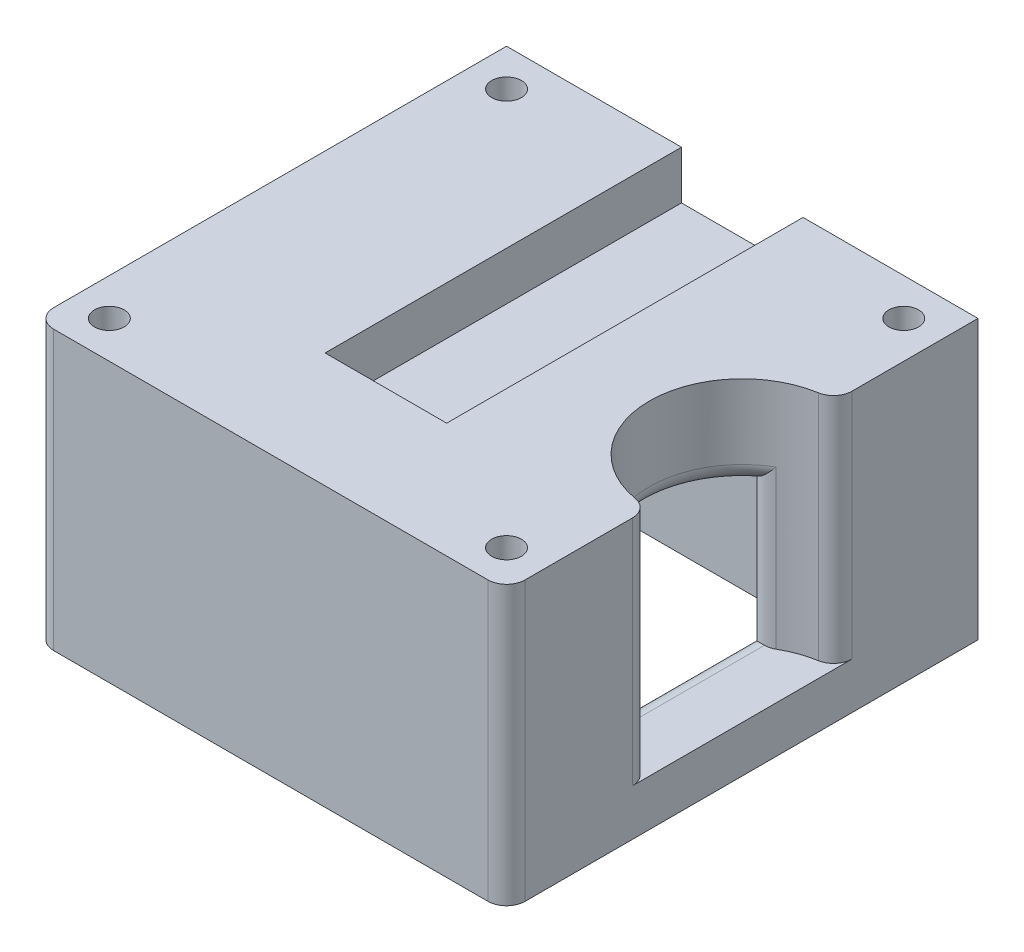
ISO-10303-21;
HEADER;
FILE_DESCRIPTION(('STEP AP214'),'2;1');
FILE_NAME('part.step','',(''),(''),'','','');
FILE_SCHEMA(('AUTOMOTIVE_DESIGN { 1 0 10303 214 1 1 1 1 }'));
ENDSEC;
DATA;
#1=APPLICATION_CONTEXT('core data for automotive mechanical design processes');
#2=APPLICATION_PROTOCOL_DEFINITION('international standard','automotive_design',2000,#1);
#3=PRODUCT_CONTEXT('',#1,'mechanical');
#4=PRODUCT('Part','Part','',(#3));
#5=PRODUCT_RELATED_PRODUCT_CATEGORY('part','',(#4));
#6=PRODUCT_DEFINITION_FORMATION('','',#4);
#7=PRODUCT_DEFINITION_CONTEXT('part definition',#1,'design');
#8=PRODUCT_DEFINITION('design','',#6,#7);
#9=PRODUCT_DEFINITION_SHAPE('','',#8);
#10=(LENGTH_UNIT() NAMED_UNIT(*) SI_UNIT(.MILLI.,.METRE.));
#11=(NAMED_UNIT(*) PLANE_ANGLE_UNIT() SI_UNIT($,.RADIAN.));
#12=(NAMED_UNIT(*) SI_UNIT($,.STERADIAN.) SOLID_ANGLE_UNIT());
#13=UNCERTAINTY_MEASURE_WITH_UNIT(LENGTH_MEASURE(1.E-05),#10,'distance_accuracy_value','');
#14=(GEOMETRIC_REPRESENTATION_CONTEXT(3) GLOBAL_UNCERTAINTY_ASSIGNED_CONTEXT((#13)) GLOBAL_UNIT_ASSIGNED_CONTEXT((#10,
#11,#12)) REPRESENTATION_CONTEXT('',''));
#15=CARTESIAN_POINT('',(0.,0.,0.));
#16=DIRECTION('',(0.,0.,1.));
#17=DIRECTION('',(1.,0.,0.));
#18=AXIS2_PLACEMENT_3D('',#15,#16,#17);
#19=CARTESIAN_POINT('',(0.,0.,0.));
#20=DIRECTION('',(0.,1.,0.));
#21=DIRECTION('',(0.,0.,1.));
#22=AXIS2_PLACEMENT_3D('',#19,#20,#21);
#23=PLANE('',#22);
#24=CARTESIAN_POINT('',(-10.7,0.,10.7));
#25=DIRECTION('',(0.,-1.,0.));
#26=DIRECTION('',(0.,0.,-1.));
#27=AXIS2_PLACEMENT_3D('',#24,#25,#26);
#28=CIRCLE('',#27,0.799999999999999);
#29=CARTESIAN_POINT('',(-10.7,0.,9.9));
#30=VERTEX_POINT('',#29);
#31=EDGE_CURVE('E559',#30,#30,#28,.T.);
#32=ORIENTED_EDGE('',*,*,#31,.F.);
#33=EDGE_LOOP('',(#32));
#34=FACE_BOUND('',#33,.T.);
#35=CARTESIAN_POINT('',(10.7,0.,10.7));
#36=DIRECTION('',(0.,-1.,0.));
#37=DIRECTION('',(0.,0.,-1.));
#38=AXIS2_PLACEMENT_3D('',#35,#36,#37);
#39=CIRCLE('',#38,0.799999999999999);
#40=CARTESIAN_POINT('',(10.7,0.,9.9));
#41=VERTEX_POINT('',#40);
#42=EDGE_CURVE('E553',#41,#41,#39,.T.);
#43=ORIENTED_EDGE('',*,*,#42,.F.);
#44=EDGE_LOOP('',(#43));
#45=FACE_BOUND('',#44,.T.);
#46=CARTESIAN_POINT('',(10.7,0.,-10.7));
#47=DIRECTION('',(0.,-1.,0.));
#48=DIRECTION('',(0.,0.,-1.));
#49=AXIS2_PLACEMENT_3D('',#46,#47,#48);
#50=CIRCLE('',#49,0.799999999999999);
#51=CARTESIAN_POINT('',(10.7,0.,-11.5));
#52=VERTEX_POINT('',#51);
#53=EDGE_CURVE('E545',#52,#52,#50,.T.);
#54=ORIENTED_EDGE('',*,*,#53,.F.);
#55=EDGE_LOOP('',(#54));
#56=FACE_BOUND('',#55,.T.);
#57=DIRECTION('',(0.,0.,-1.));
#58=VECTOR('',#57,1.);
#59=CARTESIAN_POINT('',(12.7,0.,12.7));
#60=LINE('',#59,#58);
#61=CARTESIAN_POINT('',(12.7,0.,11.7));
#62=VERTEX_POINT('',#61);
#63=CARTESIAN_POINT('',(12.7,0.,-12.7));
#64=VERTEX_POINT('',#63);
#65=EDGE_CURVE('E287',#62,#64,#60,.T.);
#66=ORIENTED_EDGE('',*,*,#65,.F.);
#67=CARTESIAN_POINT('',(11.7,0.,11.7));
#68=DIRECTION('',(0.,1.,0.));
#69=DIRECTION('',(0.,0.,1.));
#70=AXIS2_PLACEMENT_3D('',#67,#68,#69);
#71=CIRCLE('',#70,1.);
#72=CARTESIAN_POINT('',(11.7,0.,12.7));
#73=VERTEX_POINT('',#72);
#74=EDGE_CURVE('E468',#62,#73,#71,.F.);
#75=ORIENTED_EDGE('',*,*,#74,.T.);
#76=DIRECTION('',(1.,0.,0.));
#77=VECTOR('',#76,1.);
#78=CARTESIAN_POINT('',(12.7,0.,12.7));
#79=LINE('',#78,#77);
#80=CARTESIAN_POINT('',(-11.7,0.,12.7));
#81=VERTEX_POINT('',#80);
#82=EDGE_CURVE('E285',#81,#73,#79,.T.);
#83=ORIENTED_EDGE('',*,*,#82,.F.);
#84=CARTESIAN_POINT('',(-11.7,0.,11.7));
#85=DIRECTION('',(0.,1.,0.));
#86=DIRECTION('',(0.,0.,1.));
#87=AXIS2_PLACEMENT_3D('',#84,#85,#86);
#88=CIRCLE('',#87,1.);
#89=CARTESIAN_POINT('',(-12.7,0.,11.7));
#90=VERTEX_POINT('',#89);
#91=EDGE_CURVE('E469',#81,#90,#88,.F.);
#92=ORIENTED_EDGE('',*,*,#91,.T.);
#93=DIRECTION('',(0.,0.,1.));
#94=VECTOR('',#93,1.);
#95=CARTESIAN_POINT('',(-12.7,0.,12.7));
#96=LINE('',#95,#94);
#97=CARTESIAN_POINT('',(-12.7,0.,-12.7));
#98=VERTEX_POINT('',#97);
#99=EDGE_CURVE('E283',#98,#90,#96,.T.);
#100=ORIENTED_EDGE('',*,*,#99,.F.);
#101=DIRECTION('',(-1.,0.,0.));
#102=VECTOR('',#101,1.);
#103=CARTESIAN_POINT('',(12.7,0.,-12.7));
#104=LINE('',#103,#102);
#105=EDGE_CURVE('E289',#64,#98,#104,.T.);
#106=ORIENTED_EDGE('',*,*,#105,.F.);
#107=EDGE_LOOP('',(#66,#75,#83,#92,#100,#106));
#108=FACE_BOUND('',#107,.T.);
#109=DIRECTION('',(0.,0.,1.));
#110=VECTOR('',#109,1.);
#111=CARTESIAN_POINT('',(-8.7,0.,8.7));
#112=LINE('',#111,#110);
#113=CARTESIAN_POINT('',(-8.7,0.,-8.7));
#114=VERTEX_POINT('',#113);
#115=CARTESIAN_POINT('',(-8.7,0.,8.7));
#116=VERTEX_POINT('',#115);
#117=EDGE_CURVE('E248',#114,#116,#112,.T.);
#118=ORIENTED_EDGE('',*,*,#117,.T.);
#119=DIRECTION('',(1.,0.,0.));
#120=VECTOR('',#119,1.);
#121=CARTESIAN_POINT('',(8.7,0.,8.7));
#122=LINE('',#121,#120);
#123=CARTESIAN_POINT('',(8.7,0.,8.7));
#124=VERTEX_POINT('',#123);
#125=EDGE_CURVE('E266',#116,#124,#122,.T.);
#126=ORIENTED_EDGE('',*,*,#125,.T.);
#127=DIRECTION('',(0.,0.,-1.));
#128=VECTOR('',#127,1.);
#129=CARTESIAN_POINT('',(8.7,0.,8.7));
#130=LINE('',#129,#128);
#131=CARTESIAN_POINT('',(8.7,0.,-8.7));
#132=VERTEX_POINT('',#131);
#133=EDGE_CURVE('E269',#124,#132,#130,.T.);
#134=ORIENTED_EDGE('',*,*,#133,.T.);
#135=DIRECTION('',(-1.,0.,0.));
#136=VECTOR('',#135,1.);
#137=CARTESIAN_POINT('',(8.7,0.,-8.7));
#138=LINE('',#137,#136);
#139=EDGE_CURVE('E253',#132,#114,#138,.T.);
#140=ORIENTED_EDGE('',*,*,#139,.T.);
#141=EDGE_LOOP('',(#118,#126,#134,#140));
#142=FACE_BOUND('',#141,.T.);
#143=CARTESIAN_POINT('',(-10.7,0.,-10.7));
#144=DIRECTION('',(0.,-1.,0.));
#145=DIRECTION('',(0.,0.,-1.));
#146=AXIS2_PLACEMENT_3D('',#143,#144,#145);
#147=CIRCLE('',#146,0.799999999999999);
#148=CARTESIAN_POINT('',(-10.7,0.,-11.5));
#149=VERTEX_POINT('',#148);
#150=EDGE_CURVE('E540',#149,#149,#147,.T.);
#151=ORIENTED_EDGE('',*,*,#150,.F.);
#152=EDGE_LOOP('',(#151));
#153=FACE_BOUND('',#152,.T.);
#154=ADVANCED_FACE('F33',(#34,#45,#56,#108,#142,#153),#23,.F.);
#155=CARTESIAN_POINT('',(12.7,10.,-12.7));
#156=DIRECTION('',(0.,0.,1.));
#157=DIRECTION('',(1.,0.,0.));
#158=AXIS2_PLACEMENT_3D('',#155,#156,#157);
#159=PLANE('',#158);
#160=DIRECTION('',(0.,1.,0.));
#161=VECTOR('',#160,1.);
#162=CARTESIAN_POINT('',(-3.275,12.4,-12.7));
#163=LINE('',#162,#161);
#164=CARTESIAN_POINT('',(-3.275,12.4,-12.7));
#165=VERTEX_POINT('',#164);
#166=CARTESIAN_POINT('',(-3.275,15.,-12.7));
#167=VERTEX_POINT('',#166);
#168=EDGE_CURVE('E235',#165,#167,#163,.T.);
#169=ORIENTED_EDGE('',*,*,#168,.F.);
#170=DIRECTION('',(-1.,0.,0.));
#171=VECTOR('',#170,1.);
#172=CARTESIAN_POINT('',(0.,12.4,-12.7));
#173=LINE('',#172,#171);
#174=CARTESIAN_POINT('',(3.275,12.4,-12.7));
#175=VERTEX_POINT('',#174);
#176=EDGE_CURVE('E220',#175,#165,#173,.T.);
#177=ORIENTED_EDGE('',*,*,#176,.F.);
#178=DIRECTION('',(0.,1.,0.));
#179=VECTOR('',#178,1.);
#180=CARTESIAN_POINT('',(3.275,12.4,-12.7));
#181=LINE('',#180,#179);
#182=CARTESIAN_POINT('',(3.275,15.,-12.7));
#183=VERTEX_POINT('',#182);
#184=EDGE_CURVE('E207',#175,#183,#181,.T.);
#185=ORIENTED_EDGE('',*,*,#184,.T.);
#186=DIRECTION('',(-1.,0.,0.));
#187=VECTOR('',#186,1.);
#188=CARTESIAN_POINT('',(12.7,15.,-12.7));
#189=LINE('',#188,#187);
#190=CARTESIAN_POINT('',(12.7,15.,-12.7));
#191=VERTEX_POINT('',#190);
#192=EDGE_CURVE('E241',#191,#183,#189,.T.);
#193=ORIENTED_EDGE('',*,*,#192,.F.);
#194=DIRECTION('',(0.,-1.,0.));
#195=VECTOR('',#194,1.);
#196=CARTESIAN_POINT('',(12.7,10.,-12.7));
#197=LINE('',#196,#195);
#198=EDGE_CURVE('E294',#191,#64,#197,.T.);
#199=ORIENTED_EDGE('',*,*,#198,.T.);
#200=ORIENTED_EDGE('',*,*,#105,.T.);
#201=DIRECTION('',(0.,-1.,0.));
#202=VECTOR('',#201,1.);
#203=CARTESIAN_POINT('',(-12.7,10.,-12.7));
#204=LINE('',#203,#202);
#205=CARTESIAN_POINT('',(-12.7,15.,-12.7));
#206=VERTEX_POINT('',#205);
#207=EDGE_CURVE('E291',#206,#98,#204,.T.);
#208=ORIENTED_EDGE('',*,*,#207,.F.);
#209=EDGE_CURVE('E240',#167,#206,#189,.T.);
#210=ORIENTED_EDGE('',*,*,#209,.F.);
#211=EDGE_LOOP('',(#169,#177,#185,#193,#199,#200,#208,#210));
#212=FACE_BOUND('',#211,.T.);
#213=ADVANCED_FACE('F398',(#212),#159,.F.);
#214=CARTESIAN_POINT('',(0.,15.,0.));
#215=DIRECTION('',(0.,1.,0.));
#216=DIRECTION('',(0.,0.,1.));
#217=AXIS2_PLACEMENT_3D('',#214,#215,#216);
#218=PLANE('',#217);
#219=CARTESIAN_POINT('',(-10.7,15.,10.7));
#220=DIRECTION('',(0.,-1.,0.));
#221=DIRECTION('',(0.,0.,-1.));
#222=AXIS2_PLACEMENT_3D('',#219,#220,#221);
#223=CIRCLE('',#222,0.799999999999997);
#224=CARTESIAN_POINT('',(-10.7,15.,9.9));
#225=VERTEX_POINT('',#224);
#226=EDGE_CURVE('E556',#225,#225,#223,.T.);
#227=ORIENTED_EDGE('',*,*,#226,.T.);
#228=EDGE_LOOP('',(#227));
#229=FACE_BOUND('',#228,.T.);
#230=CARTESIAN_POINT('',(10.7,15.,10.7));
#231=DIRECTION('',(0.,-1.,0.));
#232=DIRECTION('',(0.,0.,-1.));
#233=AXIS2_PLACEMENT_3D('',#230,#231,#232);
#234=CIRCLE('',#233,0.799999999999997);
#235=CARTESIAN_POINT('',(10.7,15.,9.9));
#236=VERTEX_POINT('',#235);
#237=EDGE_CURVE('E550',#236,#236,#234,.T.);
#238=ORIENTED_EDGE('',*,*,#237,.T.);
#239=EDGE_LOOP('',(#238));
#240=FACE_BOUND('',#239,.T.);
#241=CARTESIAN_POINT('',(10.7,15.,-10.7));
#242=DIRECTION('',(0.,-1.,0.));
#243=DIRECTION('',(0.,0.,-1.));
#244=AXIS2_PLACEMENT_3D('',#241,#242,#243);
#245=CIRCLE('',#244,0.799999999999997);
#246=CARTESIAN_POINT('',(10.7,15.,-11.5));
#247=VERTEX_POINT('',#246);
#248=EDGE_CURVE('E542',#247,#247,#245,.T.);
#249=ORIENTED_EDGE('',*,*,#248,.T.);
#250=EDGE_LOOP('',(#249));
#251=FACE_BOUND('',#250,.T.);
#252=CARTESIAN_POINT('',(-10.7,15.,-10.7));
#253=DIRECTION('',(0.,-1.,0.));
#254=DIRECTION('',(0.,0.,-1.));
#255=AXIS2_PLACEMENT_3D('',#252,#253,#254);
#256=CIRCLE('',#255,0.799999999999997);
#257=CARTESIAN_POINT('',(-10.7,15.,-11.5));
#258=VERTEX_POINT('',#257);
#259=EDGE_CURVE('E347',#258,#258,#256,.T.);
#260=ORIENTED_EDGE('',*,*,#259,.T.);
#261=EDGE_LOOP('',(#260));
#262=FACE_BOUND('',#261,.T.);
#263=DIRECTION('',(1.,0.,0.));
#264=VECTOR('',#263,1.);
#265=CARTESIAN_POINT('',(12.7,15.,12.7));
#266=LINE('',#265,#264);
#267=CARTESIAN_POINT('',(-11.7,15.,12.7));
#268=VERTEX_POINT('',#267);
#269=CARTESIAN_POINT('',(11.7,15.,12.7));
#270=VERTEX_POINT('',#269);
#271=EDGE_CURVE('E246',#268,#270,#266,.T.);
#272=ORIENTED_EDGE('',*,*,#271,.T.);
#273=CARTESIAN_POINT('',(11.7,15.,11.7));
#274=DIRECTION('',(0.,1.,0.));
#275=DIRECTION('',(0.,0.,1.));
#276=AXIS2_PLACEMENT_3D('',#273,#274,#275);
#277=CIRCLE('',#276,1.);
#278=CARTESIAN_POINT('',(12.7,15.,11.7));
#279=VERTEX_POINT('',#278);
#280=EDGE_CURVE('E41',#270,#279,#277,.T.);
#281=ORIENTED_EDGE('',*,*,#280,.T.);
#282=DIRECTION('',(0.,0.,-1.));
#283=VECTOR('',#282,1.);
#284=CARTESIAN_POINT('',(12.7,15.,12.7));
#285=LINE('',#284,#283);
#286=CARTESIAN_POINT('',(12.7,15.,5.91607978309961));
#287=VERTEX_POINT('',#286);
#288=EDGE_CURVE('E238',#279,#287,#285,.T.);
#289=ORIENTED_EDGE('',*,*,#288,.T.);
#290=CARTESIAN_POINT('',(11.7,15.,5.91607978309961));
#291=DIRECTION('',(0.,1.,0.));
#292=DIRECTION('',(0.,0.,1.));
#293=AXIS2_PLACEMENT_3D('',#290,#291,#292);
#294=CIRCLE('',#293,1.);
#295=CARTESIAN_POINT('',(11.8666666666667,15.,4.93006648591634));
#296=VERTEX_POINT('',#295);
#297=EDGE_CURVE('E324',#287,#296,#294,.T.);
#298=ORIENTED_EDGE('',*,*,#297,.T.);
#299=CARTESIAN_POINT('',(12.7,15.,0.));
#300=DIRECTION('',(0.,1.,0.));
#301=DIRECTION('',(0.,0.,1.));
#302=AXIS2_PLACEMENT_3D('',#299,#300,#301);
#303=CIRCLE('',#302,5.);
#304=CARTESIAN_POINT('',(11.8666666666667,15.,-4.93006648591635));
#305=VERTEX_POINT('',#304);
#306=EDGE_CURVE('E447',#305,#296,#303,.T.);
#307=ORIENTED_EDGE('',*,*,#306,.F.);
#308=CARTESIAN_POINT('',(11.7,15.,-5.91607978309962));
#309=DIRECTION('',(0.,1.,0.));
#310=DIRECTION('',(0.,0.,1.));
#311=AXIS2_PLACEMENT_3D('',#308,#309,#310);
#312=CIRCLE('',#311,1.);
#313=CARTESIAN_POINT('',(12.7,15.,-5.91607978309962));
#314=VERTEX_POINT('',#313);
#315=EDGE_CURVE('E326',#305,#314,#312,.T.);
#316=ORIENTED_EDGE('',*,*,#315,.T.);
#317=EDGE_CURVE('E234',#314,#191,#285,.T.);
#318=ORIENTED_EDGE('',*,*,#317,.T.);
#319=ORIENTED_EDGE('',*,*,#192,.T.);
#320=DIRECTION('',(0.,0.,-1.));
#321=VECTOR('',#320,1.);
#322=CARTESIAN_POINT('',(3.275,15.,0.));
#323=LINE('',#322,#321);
#324=CARTESIAN_POINT('',(3.275,15.,6.5));
#325=VERTEX_POINT('',#324);
#326=EDGE_CURVE('E227',#325,#183,#323,.T.);
#327=ORIENTED_EDGE('',*,*,#326,.F.);
#328=DIRECTION('',(-1.,0.,0.));
#329=VECTOR('',#328,1.);
#330=CARTESIAN_POINT('',(0.,15.,6.5));
#331=LINE('',#330,#329);
#332=CARTESIAN_POINT('',(-3.275,15.,6.5));
#333=VERTEX_POINT('',#332);
#334=EDGE_CURVE('E203',#325,#333,#331,.T.);
#335=ORIENTED_EDGE('',*,*,#334,.T.);
#336=DIRECTION('',(0.,0.,-1.));
#337=VECTOR('',#336,1.);
#338=CARTESIAN_POINT('',(-3.275,15.,0.));
#339=LINE('',#338,#337);
#340=EDGE_CURVE('E216',#333,#167,#339,.T.);
#341=ORIENTED_EDGE('',*,*,#340,.T.);
#342=ORIENTED_EDGE('',*,*,#209,.T.);
#343=DIRECTION('',(0.,0.,1.));
#344=VECTOR('',#343,1.);
#345=CARTESIAN_POINT('',(-12.7,15.,12.7));
#346=LINE('',#345,#344);
#347=CARTESIAN_POINT('',(-12.7,15.,11.7));
#348=VERTEX_POINT('',#347);
#349=EDGE_CURVE('E244',#206,#348,#346,.T.);
#350=ORIENTED_EDGE('',*,*,#349,.T.);
#351=CARTESIAN_POINT('',(-11.7,15.,11.7));
#352=DIRECTION('',(0.,1.,0.));
#353=DIRECTION('',(0.,0.,1.));
#354=AXIS2_PLACEMENT_3D('',#351,#352,#353);
#355=CIRCLE('',#354,1.);
#356=EDGE_CURVE('E477',#348,#268,#355,.T.);
#357=ORIENTED_EDGE('',*,*,#356,.T.);
#358=EDGE_LOOP('',(#272,#281,#289,#298,#307,#316,#318,#319,#327,#335,#341,#342,#350,#357));
#359=FACE_BOUND('',#358,.T.);
#360=ADVANCED_FACE('F404',(#229,#240,#251,#262,#359),#218,.T.);
#361=CARTESIAN_POINT('',(-12.7,10.,12.7));
#362=DIRECTION('',(1.,0.,0.));
#363=DIRECTION('',(0.,0.,-1.));
#364=AXIS2_PLACEMENT_3D('',#361,#362,#363);
#365=PLANE('',#364);
#366=ORIENTED_EDGE('',*,*,#99,.T.);
#367=DIRECTION('',(0.,-1.,0.));
#368=VECTOR('',#367,1.);
#369=CARTESIAN_POINT('',(-12.7,10.,11.7));
#370=LINE('',#369,#368);
#371=EDGE_CURVE('E11',#90,#348,#370,.F.);
#372=ORIENTED_EDGE('',*,*,#371,.T.);
#373=ORIENTED_EDGE('',*,*,#349,.F.);
#374=ORIENTED_EDGE('',*,*,#207,.T.);
#375=EDGE_LOOP('',(#366,#372,#373,#374));
#376=FACE_BOUND('',#375,.T.);
#377=ADVANCED_FACE('F420',(#376),#365,.F.);
#378=CARTESIAN_POINT('',(12.7,10.,12.7));
#379=DIRECTION('',(0.,0.,-1.));
#380=DIRECTION('',(-1.,0.,0.));
#381=AXIS2_PLACEMENT_3D('',#378,#379,#380);
#382=PLANE('',#381);
#383=ORIENTED_EDGE('',*,*,#82,.T.);
#384=DIRECTION('',(0.,-1.,0.));
#385=VECTOR('',#384,1.);
#386=CARTESIAN_POINT('',(11.7,10.,12.7));
#387=LINE('',#386,#385);
#388=EDGE_CURVE('E54',#73,#270,#387,.F.);
#389=ORIENTED_EDGE('',*,*,#388,.T.);
#390=ORIENTED_EDGE('',*,*,#271,.F.);
#391=DIRECTION('',(0.,-1.,0.));
#392=VECTOR('',#391,1.);
#393=CARTESIAN_POINT('',(-11.7,10.,12.7));
#394=LINE('',#393,#392);
#395=EDGE_CURVE('E473',#268,#81,#394,.T.);
#396=ORIENTED_EDGE('',*,*,#395,.T.);
#397=EDGE_LOOP('',(#383,#389,#390,#396));
#398=FACE_BOUND('',#397,.T.);
#399=ADVANCED_FACE('F416',(#398),#382,.F.);
#400=CARTESIAN_POINT('',(12.7,10.,12.7));
#401=DIRECTION('',(-1.,0.,0.));
#402=DIRECTION('',(0.,0.,1.));
#403=AXIS2_PLACEMENT_3D('',#400,#401,#402);
#404=PLANE('',#403);
#405=ORIENTED_EDGE('',*,*,#288,.F.);
#406=DIRECTION('',(0.,-1.,0.));
#407=VECTOR('',#406,1.);
#408=CARTESIAN_POINT('',(12.7,10.,11.7));
#409=LINE('',#408,#407);
#410=EDGE_CURVE('E343',#279,#62,#409,.T.);
#411=ORIENTED_EDGE('',*,*,#410,.T.);
#412=ORIENTED_EDGE('',*,*,#65,.T.);
#413=ORIENTED_EDGE('',*,*,#198,.F.);
#414=ORIENTED_EDGE('',*,*,#317,.F.);
#415=DIRECTION('',(0.,1.,0.));
#416=VECTOR('',#415,1.);
#417=CARTESIAN_POINT('',(12.7,10.,-5.91607978309962));
#418=LINE('',#417,#416);
#419=CARTESIAN_POINT('',(12.7,2.5,-5.91607978309962));
#420=VERTEX_POINT('',#419);
#421=EDGE_CURVE('E321',#314,#420,#418,.F.);
#422=ORIENTED_EDGE('',*,*,#421,.T.);
#423=DIRECTION('',(0.,0.,-1.));
#424=VECTOR('',#423,1.);
#425=CARTESIAN_POINT('',(12.7,2.5,12.7));
#426=LINE('',#425,#424);
#427=CARTESIAN_POINT('',(12.7,2.5,5.91607978309961));
#428=VERTEX_POINT('',#427);
#429=EDGE_CURVE('E228',#428,#420,#426,.T.);
#430=ORIENTED_EDGE('',*,*,#429,.F.);
#431=DIRECTION('',(0.,1.,0.));
#432=VECTOR('',#431,1.);
#433=CARTESIAN_POINT('',(12.7,10.,5.91607978309961));
#434=LINE('',#433,#432);
#435=EDGE_CURVE('E318',#428,#287,#434,.T.);
#436=ORIENTED_EDGE('',*,*,#435,.T.);
#437=EDGE_LOOP('',(#405,#411,#412,#413,#414,#422,#430,#436));
#438=FACE_BOUND('',#437,.T.);
#439=ADVANCED_FACE('F413',(#438),#404,.F.);
#440=CARTESIAN_POINT('',(-8.7,10.,8.7));
#441=DIRECTION('',(1.,0.,0.));
#442=DIRECTION('',(0.,0.,-1.));
#443=AXIS2_PLACEMENT_3D('',#440,#441,#442);
#444=PLANE('',#443);
#445=ORIENTED_EDGE('',*,*,#117,.F.);
#446=DIRECTION('',(0.,-1.,0.));
#447=VECTOR('',#446,1.);
#448=CARTESIAN_POINT('',(-8.7,10.,-8.7));
#449=LINE('',#448,#447);
#450=CARTESIAN_POINT('',(-8.7,10.,-8.7));
#451=VERTEX_POINT('',#450);
#452=EDGE_CURVE('E263',#451,#114,#449,.T.);
#453=ORIENTED_EDGE('',*,*,#452,.F.);
#454=DIRECTION('',(0.,0.,1.));
#455=VECTOR('',#454,1.);
#456=CARTESIAN_POINT('',(-8.7,10.,8.7));
#457=LINE('',#456,#455);
#458=CARTESIAN_POINT('',(-8.7,10.,8.7));
#459=VERTEX_POINT('',#458);
#460=EDGE_CURVE('E249',#451,#459,#457,.T.);
#461=ORIENTED_EDGE('',*,*,#460,.T.);
#462=DIRECTION('',(0.,-1.,0.));
#463=VECTOR('',#462,1.);
#464=CARTESIAN_POINT('',(-8.7,10.,8.7));
#465=LINE('',#464,#463);
#466=EDGE_CURVE('E280',#459,#116,#465,.T.);
#467=ORIENTED_EDGE('',*,*,#466,.T.);
#468=EDGE_LOOP('',(#445,#453,#461,#467));
#469=FACE_BOUND('',#468,.T.);
#470=ADVANCED_FACE('F410',(#469),#444,.T.);
#471=CARTESIAN_POINT('',(8.7,10.,8.7));
#472=DIRECTION('',(0.,0.,-1.));
#473=DIRECTION('',(-1.,0.,0.));
#474=AXIS2_PLACEMENT_3D('',#471,#472,#473);
#475=PLANE('',#474);
#476=ORIENTED_EDGE('',*,*,#125,.F.);
#477=ORIENTED_EDGE('',*,*,#466,.F.);
#478=DIRECTION('',(1.,0.,0.));
#479=VECTOR('',#478,1.);
#480=CARTESIAN_POINT('',(8.7,10.,8.7));
#481=LINE('',#480,#479);
#482=CARTESIAN_POINT('',(8.7,10.,8.7));
#483=VERTEX_POINT('',#482);
#484=EDGE_CURVE('E252',#459,#483,#481,.T.);
#485=ORIENTED_EDGE('',*,*,#484,.T.);
#486=DIRECTION('',(0.,-1.,0.));
#487=VECTOR('',#486,1.);
#488=CARTESIAN_POINT('',(8.7,10.,8.7));
#489=LINE('',#488,#487);
#490=EDGE_CURVE('E278',#483,#124,#489,.T.);
#491=ORIENTED_EDGE('',*,*,#490,.T.);
#492=EDGE_LOOP('',(#476,#477,#485,#491));
#493=FACE_BOUND('',#492,.T.);
#494=ADVANCED_FACE('F514',(#493),#475,.T.);
#495=CARTESIAN_POINT('',(8.7,10.,8.7));
#496=DIRECTION('',(-1.,0.,0.));
#497=DIRECTION('',(0.,0.,1.));
#498=AXIS2_PLACEMENT_3D('',#495,#496,#497);
#499=PLANE('',#498);
#500=DIRECTION('',(0.,0.,-1.));
#501=VECTOR('',#500,1.);
#502=CARTESIAN_POINT('',(8.7,1.5,8.7));
#503=LINE('',#502,#501);
#504=CARTESIAN_POINT('',(8.7,1.5,5.19615242270663));
#505=VERTEX_POINT('',#504);
#506=CARTESIAN_POINT('',(8.7,1.5,-5.19615242270663));
#507=VERTEX_POINT('',#506);
#508=EDGE_CURVE('E299',#505,#507,#503,.T.);
#509=ORIENTED_EDGE('',*,*,#508,.T.);
#510=DIRECTION('',(0.,-1.,0.));
#511=VECTOR('',#510,1.);
#512=CARTESIAN_POINT('',(8.7,10.,-5.19615242270663));
#513=LINE('',#512,#511);
#514=CARTESIAN_POINT('',(8.7,10.,-5.19615242270663));
#515=VERTEX_POINT('',#514);
#516=EDGE_CURVE('E302',#507,#515,#513,.F.);
#517=ORIENTED_EDGE('',*,*,#516,.T.);
#518=DIRECTION('',(0.,0.,-1.));
#519=VECTOR('',#518,1.);
#520=CARTESIAN_POINT('',(8.7,10.,8.7));
#521=LINE('',#520,#519);
#522=CARTESIAN_POINT('',(8.7,10.,-8.7));
#523=VERTEX_POINT('',#522);
#524=EDGE_CURVE('E256',#515,#523,#521,.T.);
#525=ORIENTED_EDGE('',*,*,#524,.T.);
#526=DIRECTION('',(0.,-1.,0.));
#527=VECTOR('',#526,1.);
#528=CARTESIAN_POINT('',(8.7,10.,-8.7));
#529=LINE('',#528,#527);
#530=EDGE_CURVE('E276',#523,#132,#529,.T.);
#531=ORIENTED_EDGE('',*,*,#530,.T.);
#532=ORIENTED_EDGE('',*,*,#133,.F.);
#533=ORIENTED_EDGE('',*,*,#490,.F.);
#534=CARTESIAN_POINT('',(8.7,10.,5.19615242270663));
#535=VERTEX_POINT('',#534);
#536=EDGE_CURVE('E257',#483,#535,#521,.T.);
#537=ORIENTED_EDGE('',*,*,#536,.T.);
#538=DIRECTION('',(0.,-1.,0.));
#539=VECTOR('',#538,1.);
#540=CARTESIAN_POINT('',(8.7,2.5,5.19615242270663));
#541=LINE('',#540,#539);
#542=EDGE_CURVE('E297',#535,#505,#541,.T.);
#543=ORIENTED_EDGE('',*,*,#542,.T.);
#544=EDGE_LOOP('',(#509,#517,#525,#531,#532,#533,#537,#543));
#545=FACE_BOUND('',#544,.T.);
#546=ADVANCED_FACE('F511',(#545),#499,.T.);
#547=CARTESIAN_POINT('',(8.7,10.,-8.7));
#548=DIRECTION('',(0.,0.,1.));
#549=DIRECTION('',(1.,0.,0.));
#550=AXIS2_PLACEMENT_3D('',#547,#548,#549);
#551=PLANE('',#550);
#552=ORIENTED_EDGE('',*,*,#139,.F.);
#553=ORIENTED_EDGE('',*,*,#530,.F.);
#554=DIRECTION('',(-1.,0.,0.));
#555=VECTOR('',#554,1.);
#556=CARTESIAN_POINT('',(8.7,10.,-8.7));
#557=LINE('',#556,#555);
#558=EDGE_CURVE('E260',#523,#451,#557,.T.);
#559=ORIENTED_EDGE('',*,*,#558,.T.);
#560=ORIENTED_EDGE('',*,*,#452,.T.);
#561=EDGE_LOOP('',(#552,#553,#559,#560));
#562=FACE_BOUND('',#561,.T.);
#563=ADVANCED_FACE('F507',(#562),#551,.T.);
#564=CARTESIAN_POINT('',(0.,10.,0.));
#565=DIRECTION('',(0.,1.,0.));
#566=DIRECTION('',(0.,0.,1.));
#567=AXIS2_PLACEMENT_3D('',#564,#565,#566);
#568=PLANE('',#567);
#569=ORIENTED_EDGE('',*,*,#524,.F.);
#570=CARTESIAN_POINT('',(9.7,10.,-5.19615242270663));
#571=DIRECTION('',(0.,1.,0.));
#572=DIRECTION('',(0.,0.,1.));
#573=AXIS2_PLACEMENT_3D('',#570,#571,#572);
#574=CIRCLE('',#573,1.);
#575=CARTESIAN_POINT('',(8.878653534283,10.,-4.62572277476204));
#576=VERTEX_POINT('',#575);
#577=EDGE_CURVE('E331',#515,#576,#574,.T.);
#578=ORIENTED_EDGE('',*,*,#577,.T.);
#579=CARTESIAN_POINT('',(12.7,10.,0.));
#580=DIRECTION('',(0.,1.,0.));
#581=DIRECTION('',(0.,0.,1.));
#582=AXIS2_PLACEMENT_3D('',#579,#580,#581);
#583=CIRCLE('',#582,6.);
#584=CARTESIAN_POINT('',(8.878653534283,10.,4.62572277476203));
#585=VERTEX_POINT('',#584);
#586=EDGE_CURVE('E306',#576,#585,#583,.T.);
#587=ORIENTED_EDGE('',*,*,#586,.T.);
#588=CARTESIAN_POINT('',(9.7,10.,5.19615242270663));
#589=DIRECTION('',(0.,1.,0.));
#590=DIRECTION('',(0.,0.,1.));
#591=AXIS2_PLACEMENT_3D('',#588,#589,#590);
#592=CIRCLE('',#591,1.);
#593=EDGE_CURVE('E334',#585,#535,#592,.T.);
#594=ORIENTED_EDGE('',*,*,#593,.T.);
#595=ORIENTED_EDGE('',*,*,#536,.F.);
#596=ORIENTED_EDGE('',*,*,#484,.F.);
#597=ORIENTED_EDGE('',*,*,#460,.F.);
#598=ORIENTED_EDGE('',*,*,#558,.F.);
#599=EDGE_LOOP('',(#569,#578,#587,#594,#595,#596,#597,#598));
#600=FACE_BOUND('',#599,.T.);
#601=ADVANCED_FACE('F497',(#600),#568,.F.);
#602=CARTESIAN_POINT('',(0.,12.4,6.5));
#603=DIRECTION('',(0.,0.,-1.));
#604=DIRECTION('',(-1.,0.,0.));
#605=AXIS2_PLACEMENT_3D('',#602,#603,#604);
#606=PLANE('',#605);
#607=ORIENTED_EDGE('',*,*,#334,.F.);
#608=DIRECTION('',(0.,1.,0.));
#609=VECTOR('',#608,1.);
#610=CARTESIAN_POINT('',(3.275,12.4,6.5));
#611=LINE('',#610,#609);
#612=CARTESIAN_POINT('',(3.275,12.4,6.5));
#613=VERTEX_POINT('',#612);
#614=EDGE_CURVE('E196',#613,#325,#611,.T.);
#615=ORIENTED_EDGE('',*,*,#614,.F.);
#616=DIRECTION('',(-1.,0.,0.));
#617=VECTOR('',#616,1.);
#618=CARTESIAN_POINT('',(0.,12.4,6.5));
#619=LINE('',#618,#617);
#620=CARTESIAN_POINT('',(-3.275,12.4,6.5));
#621=VERTEX_POINT('',#620);
#622=EDGE_CURVE('E200',#613,#621,#619,.T.);
#623=ORIENTED_EDGE('',*,*,#622,.T.);
#624=DIRECTION('',(0.,1.,0.));
#625=VECTOR('',#624,1.);
#626=CARTESIAN_POINT('',(-3.275,12.4,6.5));
#627=LINE('',#626,#625);
#628=EDGE_CURVE('E232',#621,#333,#627,.T.);
#629=ORIENTED_EDGE('',*,*,#628,.T.);
#630=EDGE_LOOP('',(#607,#615,#623,#629));
#631=FACE_BOUND('',#630,.T.);
#632=ADVANCED_FACE('F198',(#631),#606,.T.);
#633=CARTESIAN_POINT('',(-3.275,12.4,0.));
#634=DIRECTION('',(1.,0.,0.));
#635=DIRECTION('',(0.,0.,-1.));
#636=AXIS2_PLACEMENT_3D('',#633,#634,#635);
#637=PLANE('',#636);
#638=ORIENTED_EDGE('',*,*,#340,.F.);
#639=ORIENTED_EDGE('',*,*,#628,.F.);
#640=DIRECTION('',(0.,0.,-1.));
#641=VECTOR('',#640,1.);
#642=CARTESIAN_POINT('',(-3.275,12.4,0.));
#643=LINE('',#642,#641);
#644=EDGE_CURVE('E208',#621,#165,#643,.T.);
#645=ORIENTED_EDGE('',*,*,#644,.T.);
#646=ORIENTED_EDGE('',*,*,#168,.T.);
#647=EDGE_LOOP('',(#638,#639,#645,#646));
#648=FACE_BOUND('',#647,.T.);
#649=ADVANCED_FACE('F489',(#648),#637,.T.);
#650=CARTESIAN_POINT('',(3.275,12.4,0.));
#651=DIRECTION('',(1.,0.,0.));
#652=DIRECTION('',(0.,0.,-1.));
#653=AXIS2_PLACEMENT_3D('',#650,#651,#652);
#654=PLANE('',#653);
#655=ORIENTED_EDGE('',*,*,#326,.T.);
#656=ORIENTED_EDGE('',*,*,#184,.F.);
#657=DIRECTION('',(0.,0.,-1.));
#658=VECTOR('',#657,1.);
#659=CARTESIAN_POINT('',(3.275,12.4,0.));
#660=LINE('',#659,#658);
#661=EDGE_CURVE('E214',#613,#175,#660,.T.);
#662=ORIENTED_EDGE('',*,*,#661,.F.);
#663=ORIENTED_EDGE('',*,*,#614,.T.);
#664=EDGE_LOOP('',(#655,#656,#662,#663));
#665=FACE_BOUND('',#664,.T.);
#666=ADVANCED_FACE('F218',(#665),#654,.F.);
#667=CARTESIAN_POINT('',(0.,12.4,0.));
#668=DIRECTION('',(0.,1.,0.));
#669=DIRECTION('',(0.,0.,1.));
#670=AXIS2_PLACEMENT_3D('',#667,#668,#669);
#671=PLANE('',#670);
#672=ORIENTED_EDGE('',*,*,#622,.F.);
#673=ORIENTED_EDGE('',*,*,#661,.T.);
#674=ORIENTED_EDGE('',*,*,#176,.T.);
#675=ORIENTED_EDGE('',*,*,#644,.F.);
#676=EDGE_LOOP('',(#672,#673,#674,#675));
#677=FACE_BOUND('',#676,.T.);
#678=ADVANCED_FACE('F212',(#677),#671,.T.);
#679=CARTESIAN_POINT('',(12.7,2.5,0.));
#680=DIRECTION('',(0.,1.,0.));
#681=DIRECTION('',(0.,0.,1.));
#682=AXIS2_PLACEMENT_3D('',#679,#680,#681);
#683=PLANE('',#682);
#684=CARTESIAN_POINT('',(12.7,2.5,0.));
#685=DIRECTION('',(0.,1.,0.));
#686=DIRECTION('',(0.,0.,1.));
#687=AXIS2_PLACEMENT_3D('',#684,#685,#686);
#688=CIRCLE('',#687,5.);
#689=CARTESIAN_POINT('',(11.8666666666667,2.5,-4.93006648591635));
#690=VERTEX_POINT('',#689);
#691=CARTESIAN_POINT('',(10.2,2.5,-4.33012701892219));
#692=VERTEX_POINT('',#691);
#693=EDGE_CURVE('E446',#690,#692,#688,.T.);
#694=ORIENTED_EDGE('',*,*,#693,.T.);
#695=CARTESIAN_POINT('',(9.7,2.5,-5.19615242270663));
#696=DIRECTION('',(0.,1.,0.));
#697=DIRECTION('',(0.,0.,1.));
#698=AXIS2_PLACEMENT_3D('',#695,#696,#697);
#699=CIRCLE('',#698,1.);
#700=CARTESIAN_POINT('',(9.7,2.5,-4.19615242270663));
#701=VERTEX_POINT('',#700);
#702=EDGE_CURVE('E328',#692,#701,#699,.F.);
#703=ORIENTED_EDGE('',*,*,#702,.T.);
#704=DIRECTION('',(0.,0.,-1.));
#705=VECTOR('',#704,1.);
#706=CARTESIAN_POINT('',(9.7,2.5,0.));
#707=LINE('',#706,#705);
#708=CARTESIAN_POINT('',(9.7,2.5,4.19615242270663));
#709=VERTEX_POINT('',#708);
#710=EDGE_CURVE('E304',#701,#709,#707,.F.);
#711=ORIENTED_EDGE('',*,*,#710,.T.);
#712=CARTESIAN_POINT('',(9.7,2.5,5.19615242270663));
#713=DIRECTION('',(0.,1.,0.));
#714=DIRECTION('',(0.,0.,1.));
#715=AXIS2_PLACEMENT_3D('',#712,#713,#714);
#716=CIRCLE('',#715,1.);
#717=CARTESIAN_POINT('',(10.2,2.5,4.33012701892219));
#718=VERTEX_POINT('',#717);
#719=EDGE_CURVE('E336',#709,#718,#716,.F.);
#720=ORIENTED_EDGE('',*,*,#719,.T.);
#721=CARTESIAN_POINT('',(11.8666666666667,2.5,4.93006648591634));
#722=VERTEX_POINT('',#721);
#723=EDGE_CURVE('E440',#718,#722,#688,.T.);
#724=ORIENTED_EDGE('',*,*,#723,.T.);
#725=CARTESIAN_POINT('',(11.7,2.5,5.91607978309961));
#726=DIRECTION('',(0.,1.,0.));
#727=DIRECTION('',(0.,0.,1.));
#728=AXIS2_PLACEMENT_3D('',#725,#726,#727);
#729=CIRCLE('',#728,1.);
#730=EDGE_CURVE('E340',#722,#428,#729,.F.);
#731=ORIENTED_EDGE('',*,*,#730,.T.);
#732=ORIENTED_EDGE('',*,*,#429,.T.);
#733=CARTESIAN_POINT('',(11.7,2.5,-5.91607978309962));
#734=DIRECTION('',(0.,1.,0.));
#735=DIRECTION('',(0.,0.,1.));
#736=AXIS2_PLACEMENT_3D('',#733,#734,#735);
#737=CIRCLE('',#736,1.);
#738=EDGE_CURVE('E338',#420,#690,#737,.F.);
#739=ORIENTED_EDGE('',*,*,#738,.T.);
#740=EDGE_LOOP('',(#694,#703,#711,#720,#724,#731,#732,#739));
#741=FACE_BOUND('',#740,.T.);
#742=ADVANCED_FACE('F439',(#741),#683,.T.);
#743=CARTESIAN_POINT('',(12.7,2.5,0.));
#744=DIRECTION('',(0.,1.,0.));
#745=DIRECTION('',(0.,0.,1.));
#746=AXIS2_PLACEMENT_3D('',#743,#744,#745);
#747=CYLINDRICAL_SURFACE('',#746,5.);
#748=CARTESIAN_POINT('',(12.7,11.,0.));
#749=DIRECTION('',(0.,1.,0.));
#750=DIRECTION('',(0.,0.,1.));
#751=AXIS2_PLACEMENT_3D('',#748,#749,#750);
#752=CIRCLE('',#751,5.);
#753=CARTESIAN_POINT('',(10.2,11.,4.33012701892219));
#754=VERTEX_POINT('',#753);
#755=CARTESIAN_POINT('',(10.2,11.,-4.33012701892219));
#756=VERTEX_POINT('',#755);
#757=EDGE_CURVE('E314',#754,#756,#752,.F.);
#758=ORIENTED_EDGE('',*,*,#757,.T.);
#759=DIRECTION('',(0.,1.,0.));
#760=VECTOR('',#759,1.);
#761=CARTESIAN_POINT('',(10.2,2.5,-4.33012701892219));
#762=LINE('',#761,#760);
#763=EDGE_CURVE('E316',#756,#692,#762,.F.);
#764=ORIENTED_EDGE('',*,*,#763,.T.);
#765=ORIENTED_EDGE('',*,*,#693,.F.);
#766=DIRECTION('',(0.,1.,0.));
#767=VECTOR('',#766,1.);
#768=CARTESIAN_POINT('',(11.8666666666667,2.5,-4.93006648591635));
#769=LINE('',#768,#767);
#770=EDGE_CURVE('E310',#690,#305,#769,.T.);
#771=ORIENTED_EDGE('',*,*,#770,.T.);
#772=ORIENTED_EDGE('',*,*,#306,.T.);
#773=DIRECTION('',(0.,1.,0.));
#774=VECTOR('',#773,1.);
#775=CARTESIAN_POINT('',(11.8666666666667,2.5,4.93006648591634));
#776=LINE('',#775,#774);
#777=EDGE_CURVE('E308',#296,#722,#776,.F.);
#778=ORIENTED_EDGE('',*,*,#777,.T.);
#779=ORIENTED_EDGE('',*,*,#723,.F.);
#780=DIRECTION('',(0.,1.,0.));
#781=VECTOR('',#780,1.);
#782=CARTESIAN_POINT('',(10.2,2.5,4.33012701892219));
#783=LINE('',#782,#781);
#784=EDGE_CURVE('E312',#718,#754,#783,.T.);
#785=ORIENTED_EDGE('',*,*,#784,.T.);
#786=EDGE_LOOP('',(#758,#764,#765,#771,#772,#778,#779,#785));
#787=FACE_BOUND('',#786,.T.);
#788=ADVANCED_FACE('F373',(#787),#747,.F.);
#789=CARTESIAN_POINT('',(12.7,11.,0.));
#790=DIRECTION('',(0.,1.,0.));
#791=DIRECTION('',(0.,0.,1.));
#792=AXIS2_PLACEMENT_3D('',#789,#790,#791);
#793=TOROIDAL_SURFACE('',#792,6.,1.);
#794=CARTESIAN_POINT('',(8.878653534283,10.,-4.62572277476204));
#795=CARTESIAN_POINT('',(8.89120965845405,9.99999731993285,-4.60763864379807));
#796=CARTESIAN_POINT('',(8.90436129640502,10.0007227259713,-4.58998263013791));
#797=CARTESIAN_POINT('',(8.93172617743892,10.0036211917163,-4.55565561528381));
#798=CARTESIAN_POINT('',(8.94593878638538,10.0057933927362,-4.53898403620419));
#799=CARTESIAN_POINT('',(8.98973228047525,10.0144164684688,-4.49089877477818));
#800=CARTESIAN_POINT('',(9.02070012604436,10.0229742942933,-4.46108389802933));
#801=CARTESIAN_POINT('',(9.08497065564023,10.0452089592122,-4.40652036794773));
#802=CARTESIAN_POINT('',(9.1182687560767,10.0588759665144,-4.38176212453979));
#803=CARTESIAN_POINT('',(9.1861827300729,10.090583625683,-4.33729035915537));
#804=CARTESIAN_POINT('',(9.22080107493991,10.1086328570486,-4.31758689095873));
#805=CARTESIAN_POINT('',(9.30433312053502,10.1562076554879,-4.27614859426291));
#806=CARTESIAN_POINT('',(9.35343055642389,10.1874368799323,-4.25674913453113));
#807=CARTESIAN_POINT('',(9.45079748172544,10.2548726033621,-4.22635278480739));
#808=CARTESIAN_POINT('',(9.49906485171736,10.2910901799259,-4.2153749634208));
#809=CARTESIAN_POINT('',(9.61593381936468,10.3845978586552,-4.19721410077045));
#810=CARTESIAN_POINT('',(9.68357828042395,10.4438678844299,-4.19415557379269));
#811=CARTESIAN_POINT('',(9.81417854795395,10.566615691679,-4.2005397970921));
#812=CARTESIAN_POINT('',(9.87712897765183,10.6300981456871,-4.20999665761252));
#813=CARTESIAN_POINT('',(9.98371806715209,10.7439785340811,-4.23607094283796));
#814=CARTESIAN_POINT('',(10.0284082575353,10.7939287612839,-4.25047180981773));
#815=CARTESIAN_POINT('',(10.1146997646548,10.8943708740324,-4.28501035292883));
#816=CARTESIAN_POINT('',(10.1563065131153,10.9448616186748,-4.30513762342634));
#817=CARTESIAN_POINT('',(10.1975366726041,10.9968860311819,-4.32870832388009));
#818=CARTESIAN_POINT('',(10.1987691044274,10.9984430316753,-4.32941637031557));
#819=CARTESIAN_POINT('',(10.2,11.,-4.33012701892219));
#820=B_SPLINE_CURVE_WITH_KNOTS('',3,(#794,#795,#796,#797,#798,#799,#800,#801,#802,#803,#804,
#805,#806,#807,#808,#809,#810,#811,#812,#813,#814,#815,#816,#817,#818,#819),.UNSPECIFIED.,.F.,
.F.,(4,2,2,2,2,2,2,2,2,2,2,2,4),(0.,0.0659997125569704,0.131960288517794,0.262689559075059,
0.393168546562831,0.523905074829972,0.706891996332545,0.890292031039797,1.15879303017374,
1.4275970038518,1.632964274009,1.83796072232285,1.84428528417689),.UNSPECIFIED.);
#821=EDGE_CURVE('E350',#756,#576,#820,.F.);
#822=ORIENTED_EDGE('',*,*,#821,.F.);
#823=ORIENTED_EDGE('',*,*,#757,.F.);
#824=CARTESIAN_POINT('',(8.878653534283,10.,4.62572277476203));
#825=CARTESIAN_POINT('',(8.89120965845405,9.99999731993285,4.60763864379806));
#826=CARTESIAN_POINT('',(8.90436129640502,10.0007227259713,4.58998263013791));
#827=CARTESIAN_POINT('',(8.93172617743892,10.0036211917163,4.5556556152838));
#828=CARTESIAN_POINT('',(8.94593878638538,10.0057933927362,4.53898403620419));
#829=CARTESIAN_POINT('',(8.98973228047525,10.0144164684688,4.49089877477817));
#830=CARTESIAN_POINT('',(9.02070012604436,10.0229742942933,4.46108389802932));
#831=CARTESIAN_POINT('',(9.08497065564023,10.0452089592122,4.40652036794773));
#832=CARTESIAN_POINT('',(9.1182687560767,10.0588759665144,4.38176212453979));
#833=CARTESIAN_POINT('',(9.1861827300729,10.090583625683,4.33729035915537));
#834=CARTESIAN_POINT('',(9.22080107493991,10.1086328570486,4.31758689095872));
#835=CARTESIAN_POINT('',(9.30433312053502,10.1562076554879,4.27614859426291));
#836=CARTESIAN_POINT('',(9.35343055642389,10.1874368799323,4.25674913453113));
#837=CARTESIAN_POINT('',(9.45079748172544,10.2548726033621,4.22635278480738));
#838=CARTESIAN_POINT('',(9.49906485171736,10.2910901799259,4.21537496342079));
#839=CARTESIAN_POINT('',(9.61593381936468,10.3845978586552,4.19721410077045));
#840=CARTESIAN_POINT('',(9.68357828042395,10.4438678844299,4.19415557379268));
#841=CARTESIAN_POINT('',(9.81417854795395,10.566615691679,4.2005397970921));
#842=CARTESIAN_POINT('',(9.87712897765183,10.6300981456871,4.20999665761252));
#843=CARTESIAN_POINT('',(9.98371806715209,10.7439785340811,4.23607094283795));
#844=CARTESIAN_POINT('',(10.0284082575353,10.7939287612839,4.25047180981773));
#845=CARTESIAN_POINT('',(10.1146997646548,10.8943708740324,4.28501035292882));
#846=CARTESIAN_POINT('',(10.1563065131153,10.9448616186748,4.30513762342633));
#847=CARTESIAN_POINT('',(10.1975366726041,10.9968860311819,4.32870832388009));
#848=CARTESIAN_POINT('',(10.1987691044274,10.9984430316753,4.32941637031556));
#849=CARTESIAN_POINT('',(10.2,11.,4.33012701892219));
#850=B_SPLINE_CURVE_WITH_KNOTS('',3,(#824,#825,#826,#827,#828,#829,#830,#831,#832,#833,#834,
#835,#836,#837,#838,#839,#840,#841,#842,#843,#844,#845,#846,#847,#848,#849),.UNSPECIFIED.,.F.,
.F.,(4,2,2,2,2,2,2,2,2,2,2,2,4),(0.,0.0659997125569704,0.131960288517794,0.262689559075059,
0.393168546562831,0.523905074829972,0.706891996332545,0.890292031039797,1.15879303017374,
1.4275970038518,1.632964274009,1.83796072232285,1.84428528417689),.UNSPECIFIED.);
#851=EDGE_CURVE('E359',#585,#754,#850,.T.);
#852=ORIENTED_EDGE('',*,*,#851,.F.);
#853=ORIENTED_EDGE('',*,*,#586,.F.);
#854=EDGE_LOOP('',(#822,#823,#852,#853));
#855=FACE_BOUND('',#854,.T.);
#856=ADVANCED_FACE('F369',(#855),#793,.T.);
#857=CARTESIAN_POINT('',(9.7,2.5,5.19615242270663));
#858=DIRECTION('',(0.,1.,0.));
#859=DIRECTION('',(0.,0.,1.));
#860=AXIS2_PLACEMENT_3D('',#857,#858,#859);
#861=CYLINDRICAL_SURFACE('',#860,1.);
#862=ORIENTED_EDGE('',*,*,#784,.F.);
#863=ORIENTED_EDGE('',*,*,#719,.F.);
#864=CARTESIAN_POINT('',(9.7,1.5,5.19615242270663));
#865=DIRECTION('',(0.,-0.707106781186547,-0.707106781186547));
#866=DIRECTION('',(0.,0.707106781186547,-0.707106781186547));
#867=AXIS2_PLACEMENT_3D('',#864,#865,#866);
#868=ELLIPSE('',#867,1.41421356237309,1.);
#869=EDGE_CURVE('E346',#505,#709,#868,.T.);
#870=ORIENTED_EDGE('',*,*,#869,.F.);
#871=ORIENTED_EDGE('',*,*,#542,.F.);
#872=ORIENTED_EDGE('',*,*,#593,.F.);
#873=ORIENTED_EDGE('',*,*,#851,.T.);
#874=EDGE_LOOP('',(#862,#863,#870,#871,#872,#873));
#875=FACE_BOUND('',#874,.T.);
#876=ADVANCED_FACE('F372',(#875),#861,.T.);
#877=CARTESIAN_POINT('',(9.7,2.5,-5.19615242270663));
#878=DIRECTION('',(0.,1.,0.));
#879=DIRECTION('',(0.,0.,1.));
#880=AXIS2_PLACEMENT_3D('',#877,#878,#879);
#881=CYLINDRICAL_SURFACE('',#880,1.);
#882=ORIENTED_EDGE('',*,*,#577,.F.);
#883=ORIENTED_EDGE('',*,*,#516,.F.);
#884=CARTESIAN_POINT('',(9.7,1.5,-5.19615242270663));
#885=DIRECTION('',(0.,0.707106781186547,-0.707106781186547));
#886=DIRECTION('',(0.,-0.707106781186547,-0.707106781186547));
#887=AXIS2_PLACEMENT_3D('',#884,#885,#886);
#888=ELLIPSE('',#887,1.41421356237309,1.);
#889=EDGE_CURVE('E344',#701,#507,#888,.F.);
#890=ORIENTED_EDGE('',*,*,#889,.F.);
#891=ORIENTED_EDGE('',*,*,#702,.F.);
#892=ORIENTED_EDGE('',*,*,#763,.F.);
#893=ORIENTED_EDGE('',*,*,#821,.T.);
#894=EDGE_LOOP('',(#882,#883,#890,#891,#892,#893));
#895=FACE_BOUND('',#894,.T.);
#896=ADVANCED_FACE('F366',(#895),#881,.T.);
#897=CARTESIAN_POINT('',(9.7,1.5,8.7));
#898=DIRECTION('',(0.,0.,-1.));
#899=DIRECTION('',(-1.,0.,0.));
#900=AXIS2_PLACEMENT_3D('',#897,#898,#899);
#901=CYLINDRICAL_SURFACE('',#900,1.);
#902=ORIENTED_EDGE('',*,*,#869,.T.);
#903=ORIENTED_EDGE('',*,*,#710,.F.);
#904=ORIENTED_EDGE('',*,*,#889,.T.);
#905=ORIENTED_EDGE('',*,*,#508,.F.);
#906=EDGE_LOOP('',(#902,#903,#904,#905));
#907=FACE_BOUND('',#906,.T.);
#908=ADVANCED_FACE('F384',(#907),#901,.T.);
#909=CARTESIAN_POINT('',(11.7,2.5,-5.91607978309962));
#910=DIRECTION('',(0.,1.,0.));
#911=DIRECTION('',(0.,0.,1.));
#912=AXIS2_PLACEMENT_3D('',#909,#910,#911);
#913=CYLINDRICAL_SURFACE('',#912,1.);
#914=ORIENTED_EDGE('',*,*,#315,.F.);
#915=ORIENTED_EDGE('',*,*,#770,.F.);
#916=ORIENTED_EDGE('',*,*,#738,.F.);
#917=ORIENTED_EDGE('',*,*,#421,.F.);
#918=EDGE_LOOP('',(#914,#915,#916,#917));
#919=FACE_BOUND('',#918,.T.);
#920=ADVANCED_FACE('F380',(#919),#913,.T.);
#921=CARTESIAN_POINT('',(11.7,2.5,5.91607978309961));
#922=DIRECTION('',(0.,1.,0.));
#923=DIRECTION('',(0.,0.,1.));
#924=AXIS2_PLACEMENT_3D('',#921,#922,#923);
#925=CYLINDRICAL_SURFACE('',#924,1.);
#926=ORIENTED_EDGE('',*,*,#730,.F.);
#927=ORIENTED_EDGE('',*,*,#777,.F.);
#928=ORIENTED_EDGE('',*,*,#297,.F.);
#929=ORIENTED_EDGE('',*,*,#435,.F.);
#930=EDGE_LOOP('',(#926,#927,#928,#929));
#931=FACE_BOUND('',#930,.T.);
#932=ADVANCED_FACE('F383',(#931),#925,.T.);
#933=CARTESIAN_POINT('',(11.7,10.,11.7));
#934=DIRECTION('',(0.,-1.,0.));
#935=DIRECTION('',(0.,0.,-1.));
#936=AXIS2_PLACEMENT_3D('',#933,#934,#935);
#937=CYLINDRICAL_SURFACE('',#936,1.);
#938=ORIENTED_EDGE('',*,*,#280,.F.);
#939=ORIENTED_EDGE('',*,*,#388,.F.);
#940=ORIENTED_EDGE('',*,*,#74,.F.);
#941=ORIENTED_EDGE('',*,*,#410,.F.);
#942=EDGE_LOOP('',(#938,#939,#940,#941));
#943=FACE_BOUND('',#942,.T.);
#944=ADVANCED_FACE('F387',(#943),#937,.T.);
#945=CARTESIAN_POINT('',(-11.7,10.,11.7));
#946=DIRECTION('',(0.,-1.,0.));
#947=DIRECTION('',(0.,0.,-1.));
#948=AXIS2_PLACEMENT_3D('',#945,#946,#947);
#949=CYLINDRICAL_SURFACE('',#948,1.);
#950=ORIENTED_EDGE('',*,*,#356,.F.);
#951=ORIENTED_EDGE('',*,*,#371,.F.);
#952=ORIENTED_EDGE('',*,*,#91,.F.);
#953=ORIENTED_EDGE('',*,*,#395,.F.);
#954=EDGE_LOOP('',(#950,#951,#952,#953));
#955=FACE_BOUND('',#954,.T.);
#956=ADVANCED_FACE('F35',(#955),#949,.T.);
#957=CARTESIAN_POINT('',(-10.7,0.,-10.7));
#958=DIRECTION('',(0.,-1.,0.));
#959=DIRECTION('',(0.,0.,-1.));
#960=AXIS2_PLACEMENT_3D('',#957,#958,#959);
#961=CYLINDRICAL_SURFACE('',#960,0.799999999999998);
#962=ORIENTED_EDGE('',*,*,#259,.F.);
#963=EDGE_LOOP('',(#962));
#964=FACE_BOUND('',#963,.T.);
#965=ORIENTED_EDGE('',*,*,#150,.T.);
#966=EDGE_LOOP('',(#965));
#967=FACE_BOUND('',#966,.T.);
#968=ADVANCED_FACE('F394',(#964,#967),#961,.F.);
#969=CARTESIAN_POINT('',(10.7,0.,-10.7));
#970=DIRECTION('',(0.,-1.,0.));
#971=DIRECTION('',(0.,0.,-1.));
#972=AXIS2_PLACEMENT_3D('',#969,#970,#971);
#973=CYLINDRICAL_SURFACE('',#972,0.799999999999998);
#974=ORIENTED_EDGE('',*,*,#248,.F.);
#975=EDGE_LOOP('',(#974));
#976=FACE_BOUND('',#975,.T.);
#977=ORIENTED_EDGE('',*,*,#53,.T.);
#978=EDGE_LOOP('',(#977));
#979=FACE_BOUND('',#978,.T.);
#980=ADVANCED_FACE('F570',(#976,#979),#973,.F.);
#981=CARTESIAN_POINT('',(10.7,0.,10.7));
#982=DIRECTION('',(0.,-1.,0.));
#983=DIRECTION('',(0.,0.,-1.));
#984=AXIS2_PLACEMENT_3D('',#981,#982,#983);
#985=CYLINDRICAL_SURFACE('',#984,0.799999999999998);
#986=ORIENTED_EDGE('',*,*,#237,.F.);
#987=EDGE_LOOP('',(#986));
#988=FACE_BOUND('',#987,.T.);
#989=ORIENTED_EDGE('',*,*,#42,.T.);
#990=EDGE_LOOP('',(#989));
#991=FACE_BOUND('',#990,.T.);
#992=ADVANCED_FACE('F564',(#988,#991),#985,.F.);
#993=CARTESIAN_POINT('',(-10.7,0.,10.7));
#994=DIRECTION('',(0.,-1.,0.));
#995=DIRECTION('',(0.,0.,-1.));
#996=AXIS2_PLACEMENT_3D('',#993,#994,#995);
#997=CYLINDRICAL_SURFACE('',#996,0.799999999999998);
#998=ORIENTED_EDGE('',*,*,#226,.F.);
#999=EDGE_LOOP('',(#998));
#1000=FACE_BOUND('',#999,.T.);
#1001=ORIENTED_EDGE('',*,*,#31,.T.);
#1002=EDGE_LOOP('',(#1001));
#1003=FACE_BOUND('',#1002,.T.);
#1004=ADVANCED_FACE('F562',(#1000,#1003),#997,.F.);
#1005=CLOSED_SHELL('',(#154,#213,#360,#377,#399,#439,#470,#494,#546,#563,#601,#632,#649,#666,
#678,#742,#788,#856,#876,#896,#908,#920,#932,#944,#956,#968,#980,#992,#1004));
#1006=MANIFOLD_SOLID_BREP('B2',#1005);
#1007=ADVANCED_BREP_SHAPE_REPRESENTATION('',(#18,#1006),#14);
#1008=SHAPE_DEFINITION_REPRESENTATION(#9,#1007);
ENDSEC;
END-ISO-10303-21;
